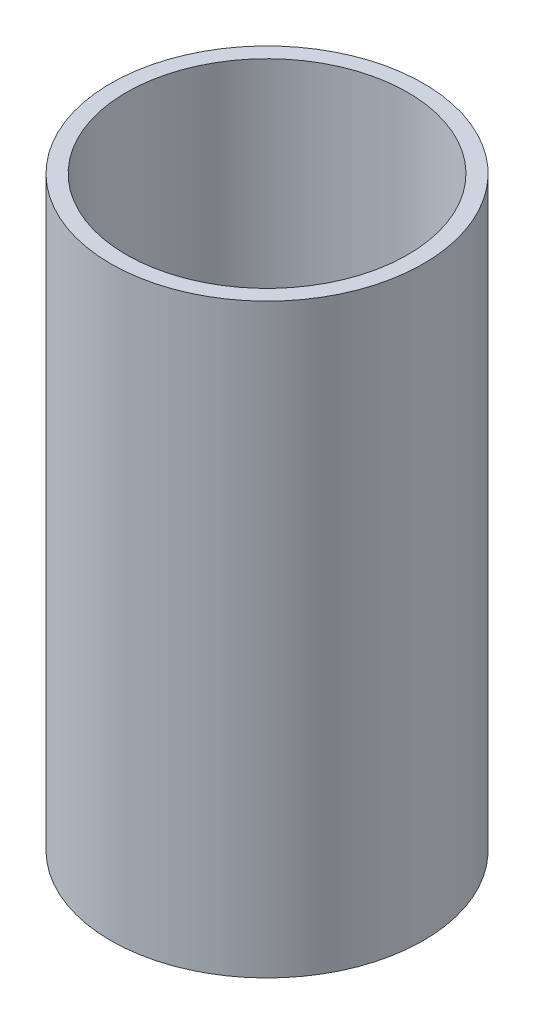
ISO-10303-21;
HEADER;
FILE_DESCRIPTION(('STEP AP214'),'2;1');
FILE_NAME('part.step','',(''),(''),'','','');
FILE_SCHEMA(('AUTOMOTIVE_DESIGN { 1 0 10303 214 1 1 1 1 }'));
ENDSEC;
DATA;
#1=APPLICATION_CONTEXT('core data for automotive mechanical design processes');
#2=APPLICATION_PROTOCOL_DEFINITION('international standard','automotive_design',2000,#1);
#3=PRODUCT_CONTEXT('',#1,'mechanical');
#4=PRODUCT('Part','Part','',(#3));
#5=PRODUCT_RELATED_PRODUCT_CATEGORY('part','',(#4));
#6=PRODUCT_DEFINITION_FORMATION('','',#4);
#7=PRODUCT_DEFINITION_CONTEXT('part definition',#1,'design');
#8=PRODUCT_DEFINITION('design','',#6,#7);
#9=PRODUCT_DEFINITION_SHAPE('','',#8);
#10=(LENGTH_UNIT() NAMED_UNIT(*) SI_UNIT(.MILLI.,.METRE.));
#11=(NAMED_UNIT(*) PLANE_ANGLE_UNIT() SI_UNIT($,.RADIAN.));
#12=(NAMED_UNIT(*) SI_UNIT($,.STERADIAN.) SOLID_ANGLE_UNIT());
#13=UNCERTAINTY_MEASURE_WITH_UNIT(LENGTH_MEASURE(1.E-05),#10,'distance_accuracy_value','');
#14=(GEOMETRIC_REPRESENTATION_CONTEXT(3) GLOBAL_UNCERTAINTY_ASSIGNED_CONTEXT((#13)) GLOBAL_UNIT_ASSIGNED_CONTEXT((#10,
#11,#12)) REPRESENTATION_CONTEXT('',''));
#15=CARTESIAN_POINT('',(0.,0.,0.));
#16=DIRECTION('',(0.,0.,1.));
#17=DIRECTION('',(1.,0.,0.));
#18=AXIS2_PLACEMENT_3D('',#15,#16,#17);
#19=CARTESIAN_POINT('',(0.,150.,0.));
#20=DIRECTION('',(0.,1.,0.));
#21=DIRECTION('',(0.,0.,1.));
#22=AXIS2_PLACEMENT_3D('',#19,#20,#21);
#23=PLANE('',#22);
#24=CARTESIAN_POINT('',(0.,150.,0.));
#25=DIRECTION('',(0.,1.,0.));
#26=DIRECTION('',(0.,0.,1.));
#27=AXIS2_PLACEMENT_3D('',#24,#25,#26);
#28=CIRCLE('',#27,40.);
#29=CARTESIAN_POINT('',(0.,150.,40.));
#30=VERTEX_POINT('',#29);
#31=EDGE_CURVE('E10',#30,#30,#28,.T.);
#32=ORIENTED_EDGE('',*,*,#31,.T.);
#33=EDGE_LOOP('',(#32));
#34=FACE_BOUND('',#33,.T.);
#35=CARTESIAN_POINT('',(0.,150.,0.));
#36=DIRECTION('',(0.,1.,0.));
#37=DIRECTION('',(0.,0.,1.));
#38=AXIS2_PLACEMENT_3D('',#35,#36,#37);
#39=CIRCLE('',#38,36.);
#40=CARTESIAN_POINT('',(0.,150.,36.));
#41=VERTEX_POINT('',#40);
#42=EDGE_CURVE('E46',#41,#41,#39,.T.);
#43=ORIENTED_EDGE('',*,*,#42,.F.);
#44=EDGE_LOOP('',(#43));
#45=FACE_BOUND('',#44,.T.);
#46=ADVANCED_FACE('F35',(#34,#45),#23,.T.);
#47=CARTESIAN_POINT('',(0.,0.,0.));
#48=DIRECTION('',(0.,1.,0.));
#49=DIRECTION('',(0.,0.,1.));
#50=AXIS2_PLACEMENT_3D('',#47,#48,#49);
#51=PLANE('',#50);
#52=CARTESIAN_POINT('',(0.,0.,0.));
#53=DIRECTION('',(0.,1.,0.));
#54=DIRECTION('',(0.,0.,1.));
#55=AXIS2_PLACEMENT_3D('',#52,#53,#54);
#56=CIRCLE('',#55,40.);
#57=CARTESIAN_POINT('',(0.,0.,40.));
#58=VERTEX_POINT('',#57);
#59=EDGE_CURVE('E39',#58,#58,#56,.T.);
#60=ORIENTED_EDGE('',*,*,#59,.F.);
#61=EDGE_LOOP('',(#60));
#62=FACE_BOUND('',#61,.T.);
#63=CARTESIAN_POINT('',(0.,0.,0.));
#64=DIRECTION('',(0.,1.,0.));
#65=DIRECTION('',(0.,0.,1.));
#66=AXIS2_PLACEMENT_3D('',#63,#64,#65);
#67=CIRCLE('',#66,36.);
#68=CARTESIAN_POINT('',(0.,0.,36.));
#69=VERTEX_POINT('',#68);
#70=EDGE_CURVE('E48',#69,#69,#67,.T.);
#71=ORIENTED_EDGE('',*,*,#70,.T.);
#72=EDGE_LOOP('',(#71));
#73=FACE_BOUND('',#72,.T.);
#74=ADVANCED_FACE('F58',(#62,#73),#51,.F.);
#75=CARTESIAN_POINT('',(0.,150.,0.));
#76=DIRECTION('',(0.,-1.,0.));
#77=DIRECTION('',(0.,0.,-1.));
#78=AXIS2_PLACEMENT_3D('',#75,#76,#77);
#79=CYLINDRICAL_SURFACE('',#78,40.);
#80=ORIENTED_EDGE('',*,*,#31,.F.);
#81=EDGE_LOOP('',(#80));
#82=FACE_BOUND('',#81,.T.);
#83=ORIENTED_EDGE('',*,*,#59,.T.);
#84=EDGE_LOOP('',(#83));
#85=FACE_BOUND('',#84,.T.);
#86=ADVANCED_FACE('F37',(#82,#85),#79,.T.);
#87=CARTESIAN_POINT('',(0.,150.,0.));
#88=DIRECTION('',(0.,-1.,0.));
#89=DIRECTION('',(0.,0.,-1.));
#90=AXIS2_PLACEMENT_3D('',#87,#88,#89);
#91=CYLINDRICAL_SURFACE('',#90,36.);
#92=ORIENTED_EDGE('',*,*,#42,.T.);
#93=EDGE_LOOP('',(#92));
#94=FACE_BOUND('',#93,.T.);
#95=ORIENTED_EDGE('',*,*,#70,.F.);
#96=EDGE_LOOP('',(#95));
#97=FACE_BOUND('',#96,.T.);
#98=ADVANCED_FACE('F54',(#94,#97),#91,.F.);
#99=CLOSED_SHELL('',(#46,#74,#86,#98));
#100=MANIFOLD_SOLID_BREP('B2',#99);
#101=ADVANCED_BREP_SHAPE_REPRESENTATION('',(#18,#100),#14);
#102=SHAPE_DEFINITION_REPRESENTATION(#9,#101);
ENDSEC;
END-ISO-10303-21;
